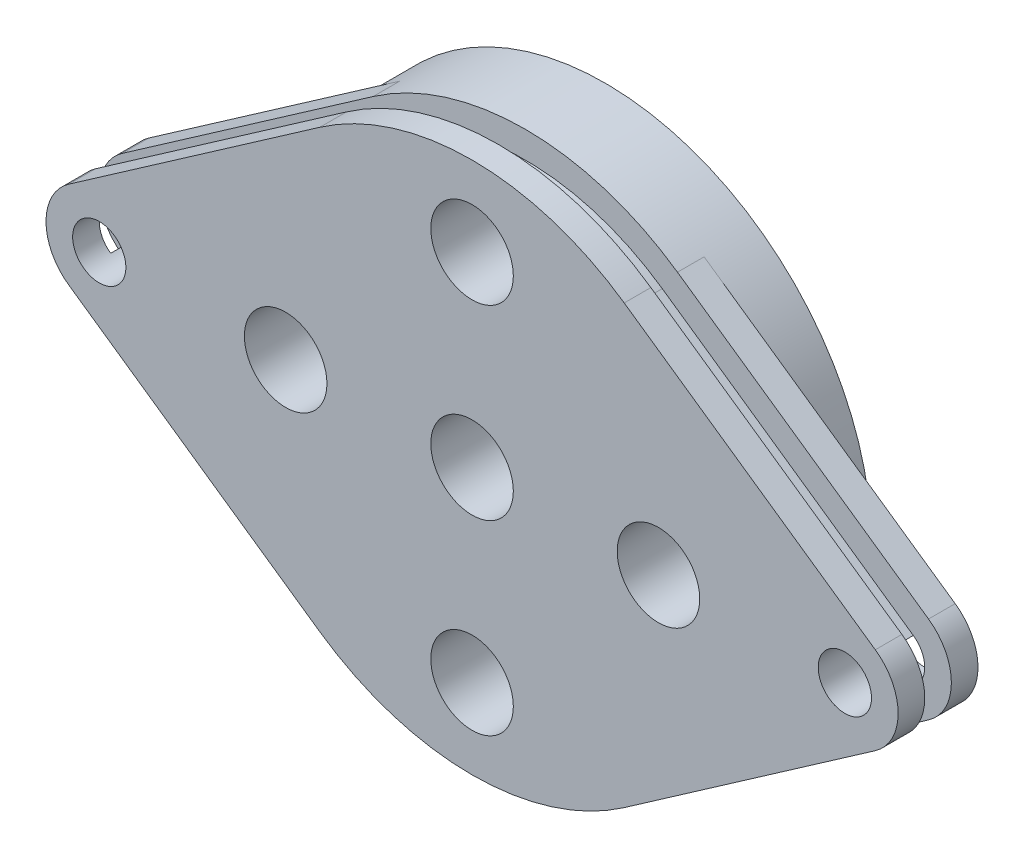
ISO-10303-21;
HEADER;
FILE_DESCRIPTION(('STEP AP214'),'2;1');
FILE_NAME('part.step','',(''),(''),'','','');
FILE_SCHEMA(('AUTOMOTIVE_DESIGN { 1 0 10303 214 1 1 1 1 }'));
ENDSEC;
DATA;
#1=APPLICATION_CONTEXT('core data for automotive mechanical design processes');
#2=APPLICATION_PROTOCOL_DEFINITION('international standard','automotive_design',2000,#1);
#3=PRODUCT_CONTEXT('',#1,'mechanical');
#4=PRODUCT('Part','Part','',(#3));
#5=PRODUCT_RELATED_PRODUCT_CATEGORY('part','',(#4));
#6=PRODUCT_DEFINITION_FORMATION('','',#4);
#7=PRODUCT_DEFINITION_CONTEXT('part definition',#1,'design');
#8=PRODUCT_DEFINITION('design','',#6,#7);
#9=PRODUCT_DEFINITION_SHAPE('','',#8);
#10=(LENGTH_UNIT() NAMED_UNIT(*) SI_UNIT(.MILLI.,.METRE.));
#11=(NAMED_UNIT(*) PLANE_ANGLE_UNIT() SI_UNIT($,.RADIAN.));
#12=(NAMED_UNIT(*) SI_UNIT($,.STERADIAN.) SOLID_ANGLE_UNIT());
#13=UNCERTAINTY_MEASURE_WITH_UNIT(LENGTH_MEASURE(1.E-05),#10,'distance_accuracy_value','');
#14=(GEOMETRIC_REPRESENTATION_CONTEXT(3) GLOBAL_UNCERTAINTY_ASSIGNED_CONTEXT((#13)) GLOBAL_UNIT_ASSIGNED_CONTEXT((#10,
#11,#12)) REPRESENTATION_CONTEXT('',''));
#15=CARTESIAN_POINT('',(0.,0.,0.));
#16=DIRECTION('',(0.,0.,1.));
#17=DIRECTION('',(1.,0.,0.));
#18=AXIS2_PLACEMENT_3D('',#15,#16,#17);
#19=CARTESIAN_POINT('',(0.,0.,0.));
#20=DIRECTION('',(0.,0.,1.));
#21=DIRECTION('',(1.,0.,0.));
#22=AXIS2_PLACEMENT_3D('',#19,#20,#21);
#23=PLANE('',#22);
#24=CARTESIAN_POINT('',(0.,0.,0.));
#25=DIRECTION('',(0.,0.,1.));
#26=DIRECTION('',(1.,0.,0.));
#27=AXIS2_PLACEMENT_3D('',#24,#25,#26);
#28=CIRCLE('',#27,10.);
#29=CARTESIAN_POINT('',(10.,0.,0.));
#30=VERTEX_POINT('',#29);
#31=EDGE_CURVE('E359',#30,#30,#28,.T.);
#32=ORIENTED_EDGE('',*,*,#31,.F.);
#33=EDGE_LOOP('',(#32));
#34=FACE_BOUND('',#33,.T.);
#35=CARTESIAN_POINT('',(0.,0.,0.));
#36=DIRECTION('',(0.,0.,1.));
#37=DIRECTION('',(1.,0.,0.));
#38=AXIS2_PLACEMENT_3D('',#35,#36,#37);
#39=CIRCLE('',#38,1.55);
#40=CARTESIAN_POINT('',(1.55,0.,0.));
#41=VERTEX_POINT('',#40);
#42=EDGE_CURVE('E356',#41,#41,#39,.T.);
#43=ORIENTED_EDGE('',*,*,#42,.T.);
#44=EDGE_LOOP('',(#43));
#45=FACE_BOUND('',#44,.T.);
#46=CARTESIAN_POINT('',(-7.,0.,0.));
#47=DIRECTION('',(0.,0.,1.));
#48=DIRECTION('',(1.,0.,0.));
#49=AXIS2_PLACEMENT_3D('',#46,#47,#48);
#50=CIRCLE('',#49,1.55);
#51=CARTESIAN_POINT('',(-5.45,0.,0.));
#52=VERTEX_POINT('',#51);
#53=EDGE_CURVE('E353',#52,#52,#50,.T.);
#54=ORIENTED_EDGE('',*,*,#53,.T.);
#55=EDGE_LOOP('',(#54));
#56=FACE_BOUND('',#55,.T.);
#57=CARTESIAN_POINT('',(0.,7.,0.));
#58=DIRECTION('',(0.,0.,1.));
#59=DIRECTION('',(1.,0.,0.));
#60=AXIS2_PLACEMENT_3D('',#57,#58,#59);
#61=CIRCLE('',#60,1.55);
#62=CARTESIAN_POINT('',(1.55000000000002,7.,0.));
#63=VERTEX_POINT('',#62);
#64=EDGE_CURVE('E350',#63,#63,#61,.T.);
#65=ORIENTED_EDGE('',*,*,#64,.T.);
#66=EDGE_LOOP('',(#65));
#67=FACE_BOUND('',#66,.T.);
#68=CARTESIAN_POINT('',(7.,0.,0.));
#69=DIRECTION('',(0.,0.,1.));
#70=DIRECTION('',(1.,0.,0.));
#71=AXIS2_PLACEMENT_3D('',#68,#69,#70);
#72=CIRCLE('',#71,1.55);
#73=CARTESIAN_POINT('',(8.55,0.,0.));
#74=VERTEX_POINT('',#73);
#75=EDGE_CURVE('E347',#74,#74,#72,.T.);
#76=ORIENTED_EDGE('',*,*,#75,.T.);
#77=EDGE_LOOP('',(#76));
#78=FACE_BOUND('',#77,.T.);
#79=CARTESIAN_POINT('',(0.,-7.00000000000003,0.));
#80=DIRECTION('',(0.,0.,1.));
#81=DIRECTION('',(1.,0.,0.));
#82=AXIS2_PLACEMENT_3D('',#79,#80,#81);
#83=CIRCLE('',#82,1.55);
#84=CARTESIAN_POINT('',(1.55,-7.00000000000003,0.));
#85=VERTEX_POINT('',#84);
#86=EDGE_CURVE('E344',#85,#85,#83,.T.);
#87=ORIENTED_EDGE('',*,*,#86,.T.);
#88=EDGE_LOOP('',(#87));
#89=FACE_BOUND('',#88,.T.);
#90=ADVANCED_FACE('F45',(#34,#45,#56,#67,#78,#89),#23,.F.);
#91=CARTESIAN_POINT('',(0.,0.,2.));
#92=DIRECTION('',(0.,0.,-1.));
#93=DIRECTION('',(-1.,0.,0.));
#94=AXIS2_PLACEMENT_3D('',#91,#92,#93);
#95=CYLINDRICAL_SURFACE('',#94,10.);
#96=CARTESIAN_POINT('',(0.,0.,2.));
#97=DIRECTION('',(0.,0.,1.));
#98=DIRECTION('',(1.,0.,0.));
#99=AXIS2_PLACEMENT_3D('',#96,#97,#98);
#100=CIRCLE('',#99,10.);
#101=CARTESIAN_POINT('',(-5.71428571428571,8.2065180664829,2.));
#102=VERTEX_POINT('',#101);
#103=CARTESIAN_POINT('',(-5.71428571428571,-8.2065180664829,2.));
#104=VERTEX_POINT('',#103);
#105=EDGE_CURVE('E362',#102,#104,#100,.T.);
#106=ORIENTED_EDGE('',*,*,#105,.F.);
#107=DIRECTION('',(0.,0.,-1.));
#108=VECTOR('',#107,1.);
#109=CARTESIAN_POINT('',(-5.71428571428571,8.2065180664829,3.));
#110=LINE('',#109,#108);
#111=CARTESIAN_POINT('',(-5.71428571428571,8.2065180664829,3.));
#112=VERTEX_POINT('',#111);
#113=EDGE_CURVE('E338',#112,#102,#110,.T.);
#114=ORIENTED_EDGE('',*,*,#113,.F.);
#115=CARTESIAN_POINT('',(0.,0.,3.));
#116=DIRECTION('',(0.,0.,1.));
#117=DIRECTION('',(1.,0.,0.));
#118=AXIS2_PLACEMENT_3D('',#115,#116,#117);
#119=CIRCLE('',#118,10.);
#120=CARTESIAN_POINT('',(5.71428571428571,8.2065180664829,3.));
#121=VERTEX_POINT('',#120);
#122=EDGE_CURVE('E279',#121,#112,#119,.T.);
#123=ORIENTED_EDGE('',*,*,#122,.F.);
#124=DIRECTION('',(0.,0.,-1.));
#125=VECTOR('',#124,1.);
#126=CARTESIAN_POINT('',(5.71428571428571,8.2065180664829,3.));
#127=LINE('',#126,#125);
#128=CARTESIAN_POINT('',(5.71428571428571,8.2065180664829,2.));
#129=VERTEX_POINT('',#128);
#130=EDGE_CURVE('E341',#121,#129,#127,.T.);
#131=ORIENTED_EDGE('',*,*,#130,.T.);
#132=CARTESIAN_POINT('',(5.71428571428571,-8.2065180664829,2.));
#133=VERTEX_POINT('',#132);
#134=EDGE_CURVE('E360',#133,#129,#100,.T.);
#135=ORIENTED_EDGE('',*,*,#134,.F.);
#136=DIRECTION('',(0.,0.,-1.));
#137=VECTOR('',#136,1.);
#138=CARTESIAN_POINT('',(5.71428571428571,-8.2065180664829,3.));
#139=LINE('',#138,#137);
#140=CARTESIAN_POINT('',(5.71428571428571,-8.2065180664829,3.));
#141=VERTEX_POINT('',#140);
#142=EDGE_CURVE('E327',#141,#133,#139,.T.);
#143=ORIENTED_EDGE('',*,*,#142,.F.);
#144=CARTESIAN_POINT('',(0.,0.,3.));
#145=DIRECTION('',(0.,0.,1.));
#146=DIRECTION('',(1.,0.,0.));
#147=AXIS2_PLACEMENT_3D('',#144,#145,#146);
#148=CIRCLE('',#147,10.);
#149=CARTESIAN_POINT('',(-5.71428571428571,-8.2065180664829,3.));
#150=VERTEX_POINT('',#149);
#151=EDGE_CURVE('E290',#150,#141,#148,.T.);
#152=ORIENTED_EDGE('',*,*,#151,.F.);
#153=DIRECTION('',(0.,0.,-1.));
#154=VECTOR('',#153,1.);
#155=CARTESIAN_POINT('',(-5.71428571428571,-8.2065180664829,3.));
#156=LINE('',#155,#154);
#157=EDGE_CURVE('E330',#150,#104,#156,.T.);
#158=ORIENTED_EDGE('',*,*,#157,.T.);
#159=EDGE_LOOP('',(#106,#114,#123,#131,#135,#143,#152,#158));
#160=FACE_BOUND('',#159,.T.);
#161=ORIENTED_EDGE('',*,*,#31,.T.);
#162=EDGE_LOOP('',(#161));
#163=FACE_BOUND('',#162,.T.);
#164=ADVANCED_FACE('F47',(#160,#163),#95,.T.);
#165=CARTESIAN_POINT('',(0.,0.,2.));
#166=DIRECTION('',(0.,0.,-1.));
#167=DIRECTION('',(-1.,0.,0.));
#168=AXIS2_PLACEMENT_3D('',#165,#166,#167);
#169=CYLINDRICAL_SURFACE('',#168,1.55);
#170=ORIENTED_EDGE('',*,*,#42,.F.);
#171=EDGE_LOOP('',(#170));
#172=FACE_BOUND('',#171,.T.);
#173=CARTESIAN_POINT('',(0.,0.,5.));
#174=DIRECTION('',(0.,0.,1.));
#175=DIRECTION('',(1.,0.,0.));
#176=AXIS2_PLACEMENT_3D('',#173,#174,#175);
#177=CIRCLE('',#176,1.55);
#178=CARTESIAN_POINT('',(1.55,0.,5.));
#179=VERTEX_POINT('',#178);
#180=EDGE_CURVE('E935',#179,#179,#177,.T.);
#181=ORIENTED_EDGE('',*,*,#180,.T.);
#182=EDGE_LOOP('',(#181));
#183=FACE_BOUND('',#182,.T.);
#184=ADVANCED_FACE('F477',(#172,#183),#169,.F.);
#185=CARTESIAN_POINT('',(-7.,0.,2.));
#186=DIRECTION('',(0.,0.,-1.));
#187=DIRECTION('',(-1.,0.,0.));
#188=AXIS2_PLACEMENT_3D('',#185,#186,#187);
#189=CYLINDRICAL_SURFACE('',#188,1.55);
#190=ORIENTED_EDGE('',*,*,#53,.F.);
#191=EDGE_LOOP('',(#190));
#192=FACE_BOUND('',#191,.T.);
#193=CARTESIAN_POINT('',(-7.,0.,5.));
#194=DIRECTION('',(0.,0.,1.));
#195=DIRECTION('',(1.,0.,0.));
#196=AXIS2_PLACEMENT_3D('',#193,#194,#195);
#197=CIRCLE('',#196,1.55);
#198=CARTESIAN_POINT('',(-5.45,0.,5.));
#199=VERTEX_POINT('',#198);
#200=EDGE_CURVE('E957',#199,#199,#197,.T.);
#201=ORIENTED_EDGE('',*,*,#200,.T.);
#202=EDGE_LOOP('',(#201));
#203=FACE_BOUND('',#202,.T.);
#204=ADVANCED_FACE('F484',(#192,#203),#189,.F.);
#205=CARTESIAN_POINT('',(0.,7.,2.));
#206=DIRECTION('',(0.,0.,-1.));
#207=DIRECTION('',(-1.,0.,0.));
#208=AXIS2_PLACEMENT_3D('',#205,#206,#207);
#209=CYLINDRICAL_SURFACE('',#208,1.55);
#210=ORIENTED_EDGE('',*,*,#64,.F.);
#211=EDGE_LOOP('',(#210));
#212=FACE_BOUND('',#211,.T.);
#213=CARTESIAN_POINT('',(0.,7.,5.));
#214=DIRECTION('',(0.,0.,1.));
#215=DIRECTION('',(1.,0.,0.));
#216=AXIS2_PLACEMENT_3D('',#213,#214,#215);
#217=CIRCLE('',#216,1.55);
#218=CARTESIAN_POINT('',(1.55000000000002,7.,5.));
#219=VERTEX_POINT('',#218);
#220=EDGE_CURVE('E940',#219,#219,#217,.T.);
#221=ORIENTED_EDGE('',*,*,#220,.T.);
#222=EDGE_LOOP('',(#221));
#223=FACE_BOUND('',#222,.T.);
#224=ADVANCED_FACE('F488',(#212,#223),#209,.F.);
#225=CARTESIAN_POINT('',(7.,0.,2.));
#226=DIRECTION('',(0.,0.,-1.));
#227=DIRECTION('',(-1.,0.,0.));
#228=AXIS2_PLACEMENT_3D('',#225,#226,#227);
#229=CYLINDRICAL_SURFACE('',#228,1.55);
#230=ORIENTED_EDGE('',*,*,#75,.F.);
#231=EDGE_LOOP('',(#230));
#232=FACE_BOUND('',#231,.T.);
#233=CARTESIAN_POINT('',(7.,0.,5.));
#234=DIRECTION('',(0.,0.,1.));
#235=DIRECTION('',(1.,0.,0.));
#236=AXIS2_PLACEMENT_3D('',#233,#234,#235);
#237=CIRCLE('',#236,1.55);
#238=CARTESIAN_POINT('',(8.55,0.,5.));
#239=VERTEX_POINT('',#238);
#240=EDGE_CURVE('E938',#239,#239,#237,.T.);
#241=ORIENTED_EDGE('',*,*,#240,.T.);
#242=EDGE_LOOP('',(#241));
#243=FACE_BOUND('',#242,.T.);
#244=ADVANCED_FACE('F492',(#232,#243),#229,.F.);
#245=CARTESIAN_POINT('',(0.,-7.00000000000003,2.));
#246=DIRECTION('',(0.,0.,-1.));
#247=DIRECTION('',(-1.,0.,0.));
#248=AXIS2_PLACEMENT_3D('',#245,#246,#247);
#249=CYLINDRICAL_SURFACE('',#248,1.55);
#250=ORIENTED_EDGE('',*,*,#86,.F.);
#251=EDGE_LOOP('',(#250));
#252=FACE_BOUND('',#251,.T.);
#253=CARTESIAN_POINT('',(0.,-7.00000000000003,5.));
#254=DIRECTION('',(0.,0.,1.));
#255=DIRECTION('',(1.,0.,0.));
#256=AXIS2_PLACEMENT_3D('',#253,#254,#255);
#257=CIRCLE('',#256,1.55);
#258=CARTESIAN_POINT('',(1.55,-7.00000000000003,5.));
#259=VERTEX_POINT('',#258);
#260=EDGE_CURVE('E941',#259,#259,#257,.T.);
#261=ORIENTED_EDGE('',*,*,#260,.T.);
#262=EDGE_LOOP('',(#261));
#263=FACE_BOUND('',#262,.T.);
#264=ADVANCED_FACE('F496',(#252,#263),#249,.F.);
#265=CARTESIAN_POINT('',(0.,0.,2.));
#266=DIRECTION('',(0.,0.,1.));
#267=DIRECTION('',(1.,0.,0.));
#268=AXIS2_PLACEMENT_3D('',#265,#266,#267);
#269=PLANE('',#268);
#270=ORIENTED_EDGE('',*,*,#105,.T.);
#271=DIRECTION('',(-0.82065180664829,0.571428571428571,0.));
#272=VECTOR('',#271,1.);
#273=CARTESIAN_POINT('',(-5.71428571428571,-8.2065180664829,2.));
#274=LINE('',#273,#272);
#275=CARTESIAN_POINT('',(-15.1428571428571,-1.64130361329658,2.));
#276=VERTEX_POINT('',#275);
#277=EDGE_CURVE('E313',#104,#276,#274,.T.);
#278=ORIENTED_EDGE('',*,*,#277,.T.);
#279=CARTESIAN_POINT('',(-14.,0.,2.));
#280=DIRECTION('',(0.,0.,1.));
#281=DIRECTION('',(1.,0.,0.));
#282=AXIS2_PLACEMENT_3D('',#279,#280,#281);
#283=CIRCLE('',#282,2.);
#284=CARTESIAN_POINT('',(-15.1428571428571,1.64130361329658,2.));
#285=VERTEX_POINT('',#284);
#286=EDGE_CURVE('E310',#285,#276,#283,.T.);
#287=ORIENTED_EDGE('',*,*,#286,.F.);
#288=DIRECTION('',(-0.82065180664829,-0.571428571428571,0.));
#289=VECTOR('',#288,1.);
#290=CARTESIAN_POINT('',(-5.71428571428571,8.2065180664829,2.));
#291=LINE('',#290,#289);
#292=EDGE_CURVE('E307',#102,#285,#291,.T.);
#293=ORIENTED_EDGE('',*,*,#292,.F.);
#294=EDGE_LOOP('',(#270,#278,#287,#293));
#295=FACE_BOUND('',#294,.T.);
#296=CARTESIAN_POINT('',(-14.,0.,2.));
#297=DIRECTION('',(0.,0.,1.));
#298=DIRECTION('',(1.,0.,0.));
#299=AXIS2_PLACEMENT_3D('',#296,#297,#298);
#300=CIRCLE('',#299,1.);
#301=CARTESIAN_POINT('',(-13.,0.,2.));
#302=VERTEX_POINT('',#301);
#303=EDGE_CURVE('E276',#302,#302,#300,.T.);
#304=ORIENTED_EDGE('',*,*,#303,.T.);
#305=EDGE_LOOP('',(#304));
#306=FACE_BOUND('',#305,.T.);
#307=ADVANCED_FACE('F500',(#295,#306),#269,.F.);
#308=ORIENTED_EDGE('',*,*,#134,.T.);
#309=DIRECTION('',(0.82065180664829,-0.571428571428571,0.));
#310=VECTOR('',#309,1.);
#311=CARTESIAN_POINT('',(5.71428571428571,8.2065180664829,2.));
#312=LINE('',#311,#310);
#313=CARTESIAN_POINT('',(15.1428571428571,1.64130361329658,2.));
#314=VERTEX_POINT('',#313);
#315=EDGE_CURVE('E304',#129,#314,#312,.T.);
#316=ORIENTED_EDGE('',*,*,#315,.T.);
#317=CARTESIAN_POINT('',(14.,0.,2.));
#318=DIRECTION('',(0.,0.,1.));
#319=DIRECTION('',(1.,0.,0.));
#320=AXIS2_PLACEMENT_3D('',#317,#318,#319);
#321=CIRCLE('',#320,2.);
#322=CARTESIAN_POINT('',(15.1428571428571,-1.64130361329658,2.));
#323=VERTEX_POINT('',#322);
#324=EDGE_CURVE('E319',#314,#323,#321,.F.);
#325=ORIENTED_EDGE('',*,*,#324,.T.);
#326=DIRECTION('',(0.82065180664829,0.571428571428571,0.));
#327=VECTOR('',#326,1.);
#328=CARTESIAN_POINT('',(5.71428571428571,-8.2065180664829,2.));
#329=LINE('',#328,#327);
#330=EDGE_CURVE('E316',#133,#323,#329,.T.);
#331=ORIENTED_EDGE('',*,*,#330,.F.);
#332=EDGE_LOOP('',(#308,#316,#325,#331));
#333=FACE_BOUND('',#332,.T.);
#334=CARTESIAN_POINT('',(14.,0.,2.));
#335=DIRECTION('',(0.,0.,1.));
#336=DIRECTION('',(1.,0.,0.));
#337=AXIS2_PLACEMENT_3D('',#334,#335,#336);
#338=CIRCLE('',#337,1.);
#339=CARTESIAN_POINT('',(15.,0.,2.));
#340=VERTEX_POINT('',#339);
#341=EDGE_CURVE('E272',#340,#340,#338,.F.);
#342=ORIENTED_EDGE('',*,*,#341,.F.);
#343=EDGE_LOOP('',(#342));
#344=FACE_BOUND('',#343,.T.);
#345=ADVANCED_FACE('F510',(#333,#344),#269,.F.);
#346=CARTESIAN_POINT('',(5.71428571428571,8.2065180664829,3.));
#347=DIRECTION('',(0.571428571428571,0.82065180664829,0.));
#348=DIRECTION('',(-0.82065180664829,0.571428571428571,0.));
#349=AXIS2_PLACEMENT_3D('',#346,#347,#348);
#350=PLANE('',#349);
#351=ORIENTED_EDGE('',*,*,#315,.F.);
#352=ORIENTED_EDGE('',*,*,#130,.F.);
#353=DIRECTION('',(0.82065180664829,-0.571428571428571,0.));
#354=VECTOR('',#353,1.);
#355=CARTESIAN_POINT('',(5.71428571428571,8.2065180664829,3.));
#356=LINE('',#355,#354);
#357=CARTESIAN_POINT('',(15.1428571428571,1.64130361329658,3.));
#358=VERTEX_POINT('',#357);
#359=EDGE_CURVE('E275',#121,#358,#356,.T.);
#360=ORIENTED_EDGE('',*,*,#359,.T.);
#361=DIRECTION('',(0.,0.,-1.));
#362=VECTOR('',#361,1.);
#363=CARTESIAN_POINT('',(15.1428571428571,1.64130361329658,3.));
#364=LINE('',#363,#362);
#365=EDGE_CURVE('E301',#358,#314,#364,.T.);
#366=ORIENTED_EDGE('',*,*,#365,.T.);
#367=EDGE_LOOP('',(#351,#352,#360,#366));
#368=FACE_BOUND('',#367,.T.);
#369=ADVANCED_FACE('F507',(#368),#350,.T.);
#370=CARTESIAN_POINT('',(-5.71428571428571,8.2065180664829,3.));
#371=DIRECTION('',(0.571428571428571,-0.82065180664829,0.));
#372=DIRECTION('',(0.82065180664829,0.571428571428571,0.));
#373=AXIS2_PLACEMENT_3D('',#370,#371,#372);
#374=PLANE('',#373);
#375=ORIENTED_EDGE('',*,*,#292,.T.);
#376=DIRECTION('',(0.,0.,-1.));
#377=VECTOR('',#376,1.);
#378=CARTESIAN_POINT('',(-15.1428571428571,1.64130361329658,3.));
#379=LINE('',#378,#377);
#380=CARTESIAN_POINT('',(-15.1428571428571,1.64130361329658,3.));
#381=VERTEX_POINT('',#380);
#382=EDGE_CURVE('E335',#381,#285,#379,.T.);
#383=ORIENTED_EDGE('',*,*,#382,.F.);
#384=DIRECTION('',(-0.82065180664829,-0.571428571428571,0.));
#385=VECTOR('',#384,1.);
#386=CARTESIAN_POINT('',(-5.71428571428571,8.2065180664829,3.));
#387=LINE('',#386,#385);
#388=EDGE_CURVE('E282',#112,#381,#387,.T.);
#389=ORIENTED_EDGE('',*,*,#388,.F.);
#390=ORIENTED_EDGE('',*,*,#113,.T.);
#391=EDGE_LOOP('',(#375,#383,#389,#390));
#392=FACE_BOUND('',#391,.T.);
#393=ADVANCED_FACE('F509',(#392),#374,.F.);
#394=CARTESIAN_POINT('',(-14.,0.,3.));
#395=DIRECTION('',(0.,0.,-1.));
#396=DIRECTION('',(-1.,0.,0.));
#397=AXIS2_PLACEMENT_3D('',#394,#395,#396);
#398=CYLINDRICAL_SURFACE('',#397,2.);
#399=ORIENTED_EDGE('',*,*,#286,.T.);
#400=DIRECTION('',(0.,0.,-1.));
#401=VECTOR('',#400,1.);
#402=CARTESIAN_POINT('',(-15.1428571428571,-1.64130361329658,3.));
#403=LINE('',#402,#401);
#404=CARTESIAN_POINT('',(-15.1428571428571,-1.64130361329658,3.));
#405=VERTEX_POINT('',#404);
#406=EDGE_CURVE('E333',#405,#276,#403,.T.);
#407=ORIENTED_EDGE('',*,*,#406,.F.);
#408=CARTESIAN_POINT('',(-14.,0.,3.));
#409=DIRECTION('',(0.,0.,1.));
#410=DIRECTION('',(1.,0.,0.));
#411=AXIS2_PLACEMENT_3D('',#408,#409,#410);
#412=CIRCLE('',#411,2.);
#413=EDGE_CURVE('E285',#381,#405,#412,.T.);
#414=ORIENTED_EDGE('',*,*,#413,.F.);
#415=ORIENTED_EDGE('',*,*,#382,.T.);
#416=EDGE_LOOP('',(#399,#407,#414,#415));
#417=FACE_BOUND('',#416,.T.);
#418=ADVANCED_FACE('F514',(#417),#398,.T.);
#419=CARTESIAN_POINT('',(-5.71428571428571,-8.2065180664829,3.));
#420=DIRECTION('',(-0.571428571428571,-0.82065180664829,0.));
#421=DIRECTION('',(0.82065180664829,-0.571428571428571,0.));
#422=AXIS2_PLACEMENT_3D('',#419,#420,#421);
#423=PLANE('',#422);
#424=ORIENTED_EDGE('',*,*,#277,.F.);
#425=ORIENTED_EDGE('',*,*,#157,.F.);
#426=DIRECTION('',(-0.82065180664829,0.571428571428571,0.));
#427=VECTOR('',#426,1.);
#428=CARTESIAN_POINT('',(-5.71428571428571,-8.2065180664829,3.));
#429=LINE('',#428,#427);
#430=EDGE_CURVE('E287',#150,#405,#429,.T.);
#431=ORIENTED_EDGE('',*,*,#430,.T.);
#432=ORIENTED_EDGE('',*,*,#406,.T.);
#433=EDGE_LOOP('',(#424,#425,#431,#432));
#434=FACE_BOUND('',#433,.T.);
#435=ADVANCED_FACE('F518',(#434),#423,.T.);
#436=CARTESIAN_POINT('',(5.71428571428571,-8.2065180664829,3.));
#437=DIRECTION('',(-0.571428571428571,0.82065180664829,0.));
#438=DIRECTION('',(-0.82065180664829,-0.571428571428571,0.));
#439=AXIS2_PLACEMENT_3D('',#436,#437,#438);
#440=PLANE('',#439);
#441=ORIENTED_EDGE('',*,*,#330,.T.);
#442=DIRECTION('',(0.,0.,-1.));
#443=VECTOR('',#442,1.);
#444=CARTESIAN_POINT('',(15.1428571428571,-1.64130361329658,3.));
#445=LINE('',#444,#443);
#446=CARTESIAN_POINT('',(15.1428571428571,-1.64130361329658,3.));
#447=VERTEX_POINT('',#446);
#448=EDGE_CURVE('E325',#447,#323,#445,.T.);
#449=ORIENTED_EDGE('',*,*,#448,.F.);
#450=DIRECTION('',(0.82065180664829,0.571428571428571,0.));
#451=VECTOR('',#450,1.);
#452=CARTESIAN_POINT('',(5.71428571428571,-8.2065180664829,3.));
#453=LINE('',#452,#451);
#454=EDGE_CURVE('E293',#141,#447,#453,.T.);
#455=ORIENTED_EDGE('',*,*,#454,.F.);
#456=ORIENTED_EDGE('',*,*,#142,.T.);
#457=EDGE_LOOP('',(#441,#449,#455,#456));
#458=FACE_BOUND('',#457,.T.);
#459=ADVANCED_FACE('F522',(#458),#440,.F.);
#460=CARTESIAN_POINT('',(-14.,0.,3.));
#461=DIRECTION('',(0.,0.,-1.));
#462=DIRECTION('',(-1.,0.,0.));
#463=AXIS2_PLACEMENT_3D('',#460,#461,#462);
#464=CYLINDRICAL_SURFACE('',#463,1.);
#465=ORIENTED_EDGE('',*,*,#303,.F.);
#466=EDGE_LOOP('',(#465));
#467=FACE_BOUND('',#466,.T.);
#468=DIRECTION('',(0.,0.,-1.));
#469=VECTOR('',#468,1.);
#470=CARTESIAN_POINT('',(-14.5714285714286,0.82065180664829,4.));
#471=LINE('',#470,#469);
#472=CARTESIAN_POINT('',(-14.5714285714286,0.820651806648291,4.));
#473=VERTEX_POINT('',#472);
#474=CARTESIAN_POINT('',(-14.5714285714286,0.820651806648289,3.));
#475=VERTEX_POINT('',#474);
#476=EDGE_CURVE('E266',#473,#475,#471,.T.);
#477=ORIENTED_EDGE('',*,*,#476,.T.);
#478=CARTESIAN_POINT('',(-14.,0.,3.));
#479=DIRECTION('',(0.,0.,1.));
#480=DIRECTION('',(1.,0.,0.));
#481=AXIS2_PLACEMENT_3D('',#478,#479,#480);
#482=CIRCLE('',#481,1.);
#483=CARTESIAN_POINT('',(-14.5714285714286,-0.820651806648292,3.));
#484=VERTEX_POINT('',#483);
#485=EDGE_CURVE('E298',#475,#484,#482,.T.);
#486=ORIENTED_EDGE('',*,*,#485,.T.);
#487=DIRECTION('',(0.,0.,-1.));
#488=VECTOR('',#487,1.);
#489=CARTESIAN_POINT('',(-14.5714285714286,-0.820651806648292,4.));
#490=LINE('',#489,#488);
#491=CARTESIAN_POINT('',(-14.5714285714286,-0.820651806648292,4.));
#492=VERTEX_POINT('',#491);
#493=EDGE_CURVE('E263',#492,#484,#490,.T.);
#494=ORIENTED_EDGE('',*,*,#493,.F.);
#495=CARTESIAN_POINT('',(-14.,0.,4.));
#496=DIRECTION('',(0.,0.,1.));
#497=DIRECTION('',(1.,0.,0.));
#498=AXIS2_PLACEMENT_3D('',#495,#496,#497);
#499=CIRCLE('',#498,1.);
#500=EDGE_CURVE('E388',#473,#492,#499,.T.);
#501=ORIENTED_EDGE('',*,*,#500,.F.);
#502=EDGE_LOOP('',(#477,#486,#494,#501));
#503=FACE_BOUND('',#502,.T.);
#504=CARTESIAN_POINT('',(-14.,0.,5.));
#505=DIRECTION('',(0.,0.,1.));
#506=DIRECTION('',(1.,0.,0.));
#507=AXIS2_PLACEMENT_3D('',#504,#505,#506);
#508=CIRCLE('',#507,1.);
#509=CARTESIAN_POINT('',(-13.,0.,5.));
#510=VERTEX_POINT('',#509);
#511=EDGE_CURVE('E393',#510,#510,#508,.T.);
#512=ORIENTED_EDGE('',*,*,#511,.T.);
#513=EDGE_LOOP('',(#512));
#514=FACE_BOUND('',#513,.T.);
#515=ADVANCED_FACE('F391',(#467,#503,#514),#464,.F.);
#516=CARTESIAN_POINT('',(14.,0.,3.));
#517=DIRECTION('',(0.,0.,-1.));
#518=DIRECTION('',(-1.,0.,0.));
#519=AXIS2_PLACEMENT_3D('',#516,#517,#518);
#520=CYLINDRICAL_SURFACE('',#519,2.);
#521=ORIENTED_EDGE('',*,*,#324,.F.);
#522=ORIENTED_EDGE('',*,*,#365,.F.);
#523=CARTESIAN_POINT('',(14.,0.,3.));
#524=DIRECTION('',(0.,0.,1.));
#525=DIRECTION('',(1.,0.,0.));
#526=AXIS2_PLACEMENT_3D('',#523,#524,#525);
#527=CIRCLE('',#526,2.);
#528=EDGE_CURVE('E295',#358,#447,#527,.F.);
#529=ORIENTED_EDGE('',*,*,#528,.T.);
#530=ORIENTED_EDGE('',*,*,#448,.T.);
#531=EDGE_LOOP('',(#521,#522,#529,#530));
#532=FACE_BOUND('',#531,.T.);
#533=ADVANCED_FACE('F505',(#532),#520,.T.);
#534=CARTESIAN_POINT('',(14.,0.,3.));
#535=DIRECTION('',(0.,0.,-1.));
#536=DIRECTION('',(-1.,0.,0.));
#537=AXIS2_PLACEMENT_3D('',#534,#535,#536);
#538=CYLINDRICAL_SURFACE('',#537,1.);
#539=DIRECTION('',(0.,0.,-1.));
#540=VECTOR('',#539,1.);
#541=CARTESIAN_POINT('',(14.5714285714286,-0.82065180664829,4.));
#542=LINE('',#541,#540);
#543=CARTESIAN_POINT('',(14.5714285714286,-0.820651806648291,4.));
#544=VERTEX_POINT('',#543);
#545=CARTESIAN_POINT('',(14.5714285714286,-0.820651806648289,3.));
#546=VERTEX_POINT('',#545);
#547=EDGE_CURVE('E254',#544,#546,#542,.T.);
#548=ORIENTED_EDGE('',*,*,#547,.T.);
#549=CARTESIAN_POINT('',(14.,0.,3.));
#550=DIRECTION('',(0.,0.,1.));
#551=DIRECTION('',(1.,0.,0.));
#552=AXIS2_PLACEMENT_3D('',#549,#550,#551);
#553=CIRCLE('',#552,1.);
#554=CARTESIAN_POINT('',(14.5714285714286,0.820651806648294,3.));
#555=VERTEX_POINT('',#554);
#556=EDGE_CURVE('E273',#555,#546,#553,.F.);
#557=ORIENTED_EDGE('',*,*,#556,.F.);
#558=DIRECTION('',(0.,0.,-1.));
#559=VECTOR('',#558,1.);
#560=CARTESIAN_POINT('',(14.5714285714286,0.820651806648292,4.));
#561=LINE('',#560,#559);
#562=CARTESIAN_POINT('',(14.5714285714286,0.820651806648292,4.));
#563=VERTEX_POINT('',#562);
#564=EDGE_CURVE('E251',#563,#555,#561,.T.);
#565=ORIENTED_EDGE('',*,*,#564,.F.);
#566=CARTESIAN_POINT('',(14.,0.,4.));
#567=DIRECTION('',(0.,0.,1.));
#568=DIRECTION('',(1.,0.,0.));
#569=AXIS2_PLACEMENT_3D('',#566,#567,#568);
#570=CIRCLE('',#569,1.);
#571=EDGE_CURVE('E399',#544,#563,#570,.T.);
#572=ORIENTED_EDGE('',*,*,#571,.F.);
#573=EDGE_LOOP('',(#548,#557,#565,#572));
#574=FACE_BOUND('',#573,.T.);
#575=ORIENTED_EDGE('',*,*,#341,.T.);
#576=EDGE_LOOP('',(#575));
#577=FACE_BOUND('',#576,.T.);
#578=CARTESIAN_POINT('',(14.,0.,5.));
#579=DIRECTION('',(0.,0.,1.));
#580=DIRECTION('',(1.,0.,0.));
#581=AXIS2_PLACEMENT_3D('',#578,#579,#580);
#582=CIRCLE('',#581,1.);
#583=CARTESIAN_POINT('',(15.,0.,5.));
#584=VERTEX_POINT('',#583);
#585=EDGE_CURVE('E394',#584,#584,#582,.T.);
#586=ORIENTED_EDGE('',*,*,#585,.T.);
#587=EDGE_LOOP('',(#586));
#588=FACE_BOUND('',#587,.T.);
#589=ADVANCED_FACE('F502',(#574,#577,#588),#538,.F.);
#590=CARTESIAN_POINT('',(0.,0.,3.));
#591=DIRECTION('',(0.,0.,1.));
#592=DIRECTION('',(1.,0.,0.));
#593=AXIS2_PLACEMENT_3D('',#590,#591,#592);
#594=PLANE('',#593);
#595=DIRECTION('',(0.82065180664829,-0.571428571428571,0.));
#596=VECTOR('',#595,1.);
#597=CARTESIAN_POINT('',(-5.14285714285713,-7.38586625983461,3.));
#598=LINE('',#597,#596);
#599=CARTESIAN_POINT('',(-5.14285714285712,-7.38586625983461,3.));
#600=VERTEX_POINT('',#599);
#601=EDGE_CURVE('E11',#484,#600,#598,.T.);
#602=ORIENTED_EDGE('',*,*,#601,.F.);
#603=ORIENTED_EDGE('',*,*,#485,.F.);
#604=DIRECTION('',(0.82065180664829,0.571428571428571,0.));
#605=VECTOR('',#604,1.);
#606=CARTESIAN_POINT('',(-5.14285714285713,7.38586625983461,3.));
#607=LINE('',#606,#605);
#608=CARTESIAN_POINT('',(-5.14285714285716,7.38586625983459,3.));
#609=VERTEX_POINT('',#608);
#610=EDGE_CURVE('E371',#475,#609,#607,.T.);
#611=ORIENTED_EDGE('',*,*,#610,.T.);
#612=CARTESIAN_POINT('',(0.,-3.88578058618805E-13,3.));
#613=DIRECTION('',(0.,0.,1.));
#614=DIRECTION('',(1.,0.,0.));
#615=AXIS2_PLACEMENT_3D('',#612,#613,#614);
#616=CIRCLE('',#615,9.00000000000031);
#617=CARTESIAN_POINT('',(5.14285714285714,7.38586625983461,3.));
#618=VERTEX_POINT('',#617);
#619=EDGE_CURVE('E368',#618,#609,#616,.T.);
#620=ORIENTED_EDGE('',*,*,#619,.F.);
#621=DIRECTION('',(-0.82065180664829,0.571428571428571,0.));
#622=VECTOR('',#621,1.);
#623=CARTESIAN_POINT('',(5.14285714285714,7.38586625983461,3.));
#624=LINE('',#623,#622);
#625=EDGE_CURVE('E365',#555,#618,#624,.T.);
#626=ORIENTED_EDGE('',*,*,#625,.F.);
#627=ORIENTED_EDGE('',*,*,#556,.T.);
#628=DIRECTION('',(-0.82065180664829,-0.571428571428571,0.));
#629=VECTOR('',#628,1.);
#630=CARTESIAN_POINT('',(5.14285714285714,-7.38586625983461,3.));
#631=LINE('',#630,#629);
#632=CARTESIAN_POINT('',(5.14285714285712,-7.38586625983462,3.));
#633=VERTEX_POINT('',#632);
#634=EDGE_CURVE('E63',#546,#633,#631,.T.);
#635=ORIENTED_EDGE('',*,*,#634,.T.);
#636=CARTESIAN_POINT('',(0.,-3.88578058618805E-13,3.));
#637=DIRECTION('',(0.,0.,1.));
#638=DIRECTION('',(1.,0.,0.));
#639=AXIS2_PLACEMENT_3D('',#636,#637,#638);
#640=CIRCLE('',#639,8.99999999999967);
#641=EDGE_CURVE('E53',#633,#600,#640,.F.);
#642=ORIENTED_EDGE('',*,*,#641,.T.);
#643=EDGE_LOOP('',(#602,#603,#611,#620,#626,#627,#635,#642));
#644=FACE_BOUND('',#643,.T.);
#645=ORIENTED_EDGE('',*,*,#359,.F.);
#646=ORIENTED_EDGE('',*,*,#122,.T.);
#647=ORIENTED_EDGE('',*,*,#388,.T.);
#648=ORIENTED_EDGE('',*,*,#413,.T.);
#649=ORIENTED_EDGE('',*,*,#430,.F.);
#650=ORIENTED_EDGE('',*,*,#151,.T.);
#651=ORIENTED_EDGE('',*,*,#454,.T.);
#652=ORIENTED_EDGE('',*,*,#528,.F.);
#653=EDGE_LOOP('',(#645,#646,#647,#648,#649,#650,#651,#652));
#654=FACE_BOUND('',#653,.T.);
#655=ADVANCED_FACE('F374',(#644,#654),#594,.T.);
#656=CARTESIAN_POINT('',(0.,-3.88578058618805E-13,4.));
#657=DIRECTION('',(0.,0.,-1.));
#658=DIRECTION('',(-1.,0.,0.));
#659=AXIS2_PLACEMENT_3D('',#656,#657,#658);
#660=CYLINDRICAL_SURFACE('',#659,9.00000000000031);
#661=DIRECTION('',(0.,0.,-1.));
#662=VECTOR('',#661,1.);
#663=CARTESIAN_POINT('',(5.14285714285714,7.38586625983461,4.));
#664=LINE('',#663,#662);
#665=CARTESIAN_POINT('',(5.14285714285714,7.38586625983461,4.));
#666=VERTEX_POINT('',#665);
#667=EDGE_CURVE('E248',#666,#618,#664,.T.);
#668=ORIENTED_EDGE('',*,*,#667,.T.);
#669=ORIENTED_EDGE('',*,*,#619,.T.);
#670=DIRECTION('',(0.,0.,-1.));
#671=VECTOR('',#670,1.);
#672=CARTESIAN_POINT('',(-5.14285714285716,7.38586625983459,4.));
#673=LINE('',#672,#671);
#674=CARTESIAN_POINT('',(-5.14285714285716,7.38586625983459,4.));
#675=VERTEX_POINT('',#674);
#676=EDGE_CURVE('E269',#675,#609,#673,.T.);
#677=ORIENTED_EDGE('',*,*,#676,.F.);
#678=CARTESIAN_POINT('',(0.,-3.88578058618805E-13,4.));
#679=DIRECTION('',(0.,0.,1.));
#680=DIRECTION('',(1.,0.,0.));
#681=AXIS2_PLACEMENT_3D('',#678,#679,#680);
#682=CIRCLE('',#681,9.00000000000031);
#683=EDGE_CURVE('E228',#675,#666,#682,.F.);
#684=ORIENTED_EDGE('',*,*,#683,.T.);
#685=EDGE_LOOP('',(#668,#669,#677,#684));
#686=FACE_BOUND('',#685,.T.);
#687=ADVANCED_FACE('F380',(#686),#660,.T.);
#688=CARTESIAN_POINT('',(-5.14285714285713,7.38586625983461,4.));
#689=DIRECTION('',(0.571428571428571,-0.82065180664829,0.));
#690=DIRECTION('',(0.82065180664829,0.571428571428571,0.));
#691=AXIS2_PLACEMENT_3D('',#688,#689,#690);
#692=PLANE('',#691);
#693=ORIENTED_EDGE('',*,*,#610,.F.);
#694=ORIENTED_EDGE('',*,*,#476,.F.);
#695=DIRECTION('',(-0.82065180664829,-0.571428571428571,0.));
#696=VECTOR('',#695,1.);
#697=CARTESIAN_POINT('',(-5.14285714285713,7.38586625983461,4.));
#698=LINE('',#697,#696);
#699=EDGE_CURVE('E231',#675,#473,#698,.T.);
#700=ORIENTED_EDGE('',*,*,#699,.F.);
#701=ORIENTED_EDGE('',*,*,#676,.T.);
#702=EDGE_LOOP('',(#693,#694,#700,#701));
#703=FACE_BOUND('',#702,.T.);
#704=ADVANCED_FACE('F383',(#703),#692,.F.);
#705=CARTESIAN_POINT('',(-5.14285714285713,-7.38586625983461,4.));
#706=DIRECTION('',(-0.571428571428571,-0.82065180664829,0.));
#707=DIRECTION('',(0.82065180664829,-0.571428571428571,0.));
#708=AXIS2_PLACEMENT_3D('',#705,#706,#707);
#709=PLANE('',#708);
#710=ORIENTED_EDGE('',*,*,#493,.T.);
#711=ORIENTED_EDGE('',*,*,#601,.T.);
#712=DIRECTION('',(0.,0.,-1.));
#713=VECTOR('',#712,1.);
#714=CARTESIAN_POINT('',(-5.14285714285712,-7.38586625983461,4.));
#715=LINE('',#714,#713);
#716=CARTESIAN_POINT('',(-5.14285714285712,-7.38586625983461,4.));
#717=VERTEX_POINT('',#716);
#718=EDGE_CURVE('E260',#717,#600,#715,.T.);
#719=ORIENTED_EDGE('',*,*,#718,.F.);
#720=DIRECTION('',(-0.82065180664829,0.571428571428571,0.));
#721=VECTOR('',#720,1.);
#722=CARTESIAN_POINT('',(-5.14285714285713,-7.38586625983461,4.));
#723=LINE('',#722,#721);
#724=EDGE_CURVE('E238',#717,#492,#723,.T.);
#725=ORIENTED_EDGE('',*,*,#724,.T.);
#726=EDGE_LOOP('',(#710,#711,#719,#725));
#727=FACE_BOUND('',#726,.T.);
#728=ADVANCED_FACE('F542',(#727),#709,.T.);
#729=CARTESIAN_POINT('',(0.,-3.88578058618805E-13,4.));
#730=DIRECTION('',(0.,0.,-1.));
#731=DIRECTION('',(-1.,0.,0.));
#732=AXIS2_PLACEMENT_3D('',#729,#730,#731);
#733=CYLINDRICAL_SURFACE('',#732,8.99999999999967);
#734=ORIENTED_EDGE('',*,*,#641,.F.);
#735=DIRECTION('',(0.,0.,-1.));
#736=VECTOR('',#735,1.);
#737=CARTESIAN_POINT('',(5.14285714285712,-7.38586625983462,4.));
#738=LINE('',#737,#736);
#739=CARTESIAN_POINT('',(5.14285714285712,-7.38586625983462,4.));
#740=VERTEX_POINT('',#739);
#741=EDGE_CURVE('E257',#740,#633,#738,.T.);
#742=ORIENTED_EDGE('',*,*,#741,.F.);
#743=CARTESIAN_POINT('',(0.,-3.88578058618805E-13,4.));
#744=DIRECTION('',(0.,0.,1.));
#745=DIRECTION('',(1.,0.,0.));
#746=AXIS2_PLACEMENT_3D('',#743,#744,#745);
#747=CIRCLE('',#746,8.99999999999967);
#748=EDGE_CURVE('E241',#717,#740,#747,.T.);
#749=ORIENTED_EDGE('',*,*,#748,.F.);
#750=ORIENTED_EDGE('',*,*,#718,.T.);
#751=EDGE_LOOP('',(#734,#742,#749,#750));
#752=FACE_BOUND('',#751,.T.);
#753=ADVANCED_FACE('F545',(#752),#733,.T.);
#754=CARTESIAN_POINT('',(5.14285714285714,-7.38586625983461,4.));
#755=DIRECTION('',(-0.571428571428571,0.82065180664829,0.));
#756=DIRECTION('',(-0.82065180664829,-0.571428571428571,0.));
#757=AXIS2_PLACEMENT_3D('',#754,#755,#756);
#758=PLANE('',#757);
#759=ORIENTED_EDGE('',*,*,#634,.F.);
#760=ORIENTED_EDGE('',*,*,#547,.F.);
#761=DIRECTION('',(0.82065180664829,0.571428571428571,0.));
#762=VECTOR('',#761,1.);
#763=CARTESIAN_POINT('',(5.14285714285714,-7.38586625983461,4.));
#764=LINE('',#763,#762);
#765=EDGE_CURVE('E243',#740,#544,#764,.T.);
#766=ORIENTED_EDGE('',*,*,#765,.F.);
#767=ORIENTED_EDGE('',*,*,#741,.T.);
#768=EDGE_LOOP('',(#759,#760,#766,#767));
#769=FACE_BOUND('',#768,.T.);
#770=ADVANCED_FACE('F549',(#769),#758,.F.);
#771=CARTESIAN_POINT('',(5.14285714285714,7.38586625983461,4.));
#772=DIRECTION('',(0.571428571428571,0.82065180664829,0.));
#773=DIRECTION('',(-0.82065180664829,0.571428571428571,0.));
#774=AXIS2_PLACEMENT_3D('',#771,#772,#773);
#775=PLANE('',#774);
#776=ORIENTED_EDGE('',*,*,#564,.T.);
#777=ORIENTED_EDGE('',*,*,#625,.T.);
#778=ORIENTED_EDGE('',*,*,#667,.F.);
#779=DIRECTION('',(0.82065180664829,-0.571428571428571,0.));
#780=VECTOR('',#779,1.);
#781=CARTESIAN_POINT('',(5.14285714285714,7.38586625983461,4.));
#782=LINE('',#781,#780);
#783=EDGE_CURVE('E245',#666,#563,#782,.T.);
#784=ORIENTED_EDGE('',*,*,#783,.T.);
#785=EDGE_LOOP('',(#776,#777,#778,#784));
#786=FACE_BOUND('',#785,.T.);
#787=ADVANCED_FACE('F553',(#786),#775,.T.);
#788=CARTESIAN_POINT('',(14.,0.,5.));
#789=DIRECTION('',(0.,0.,1.));
#790=DIRECTION('',(1.,0.,0.));
#791=AXIS2_PLACEMENT_3D('',#788,#789,#790);
#792=PLANE('',#791);
#793=ORIENTED_EDGE('',*,*,#180,.F.);
#794=EDGE_LOOP('',(#793));
#795=FACE_BOUND('',#794,.T.);
#796=ORIENTED_EDGE('',*,*,#240,.F.);
#797=EDGE_LOOP('',(#796));
#798=FACE_BOUND('',#797,.T.);
#799=ORIENTED_EDGE('',*,*,#585,.F.);
#800=EDGE_LOOP('',(#799));
#801=FACE_BOUND('',#800,.T.);
#802=CARTESIAN_POINT('',(14.,0.,5.));
#803=DIRECTION('',(0.,0.,1.));
#804=DIRECTION('',(1.,0.,0.));
#805=AXIS2_PLACEMENT_3D('',#802,#803,#804);
#806=CIRCLE('',#805,2.);
#807=CARTESIAN_POINT('',(15.1428571428571,-1.64130361329658,5.));
#808=VERTEX_POINT('',#807);
#809=CARTESIAN_POINT('',(15.1428571428571,1.64130361329658,5.));
#810=VERTEX_POINT('',#809);
#811=EDGE_CURVE('E213',#808,#810,#806,.T.);
#812=ORIENTED_EDGE('',*,*,#811,.T.);
#813=DIRECTION('',(-0.82065180664829,0.571428571428571,0.));
#814=VECTOR('',#813,1.);
#815=CARTESIAN_POINT('',(15.1428571428571,1.64130361329658,5.));
#816=LINE('',#815,#814);
#817=CARTESIAN_POINT('',(5.71428571428571,8.2065180664829,5.));
#818=VERTEX_POINT('',#817);
#819=EDGE_CURVE('E202',#810,#818,#816,.T.);
#820=ORIENTED_EDGE('',*,*,#819,.T.);
#821=CARTESIAN_POINT('',(0.,0.,5.));
#822=DIRECTION('',(0.,0.,1.));
#823=DIRECTION('',(1.,0.,0.));
#824=AXIS2_PLACEMENT_3D('',#821,#822,#823);
#825=CIRCLE('',#824,10.);
#826=CARTESIAN_POINT('',(-5.71428571428571,8.2065180664829,5.));
#827=VERTEX_POINT('',#826);
#828=EDGE_CURVE('E212',#818,#827,#825,.T.);
#829=ORIENTED_EDGE('',*,*,#828,.T.);
#830=DIRECTION('',(-0.82065180664829,-0.571428571428571,0.));
#831=VECTOR('',#830,1.);
#832=CARTESIAN_POINT('',(-5.71428571428571,8.2065180664829,5.));
#833=LINE('',#832,#831);
#834=CARTESIAN_POINT('',(-15.1428571428571,1.64130361329658,5.));
#835=VERTEX_POINT('',#834);
#836=EDGE_CURVE('E404',#827,#835,#833,.T.);
#837=ORIENTED_EDGE('',*,*,#836,.T.);
#838=CARTESIAN_POINT('',(-14.,0.,5.));
#839=DIRECTION('',(0.,0.,1.));
#840=DIRECTION('',(1.,0.,0.));
#841=AXIS2_PLACEMENT_3D('',#838,#839,#840);
#842=CIRCLE('',#841,2.);
#843=CARTESIAN_POINT('',(-15.1428571428571,-1.64130361329658,5.));
#844=VERTEX_POINT('',#843);
#845=EDGE_CURVE('E406',#835,#844,#842,.T.);
#846=ORIENTED_EDGE('',*,*,#845,.T.);
#847=DIRECTION('',(0.82065180664829,-0.571428571428571,0.));
#848=VECTOR('',#847,1.);
#849=CARTESIAN_POINT('',(-15.1428571428571,-1.64130361329658,5.));
#850=LINE('',#849,#848);
#851=CARTESIAN_POINT('',(-5.71428571428571,-8.2065180664829,5.));
#852=VERTEX_POINT('',#851);
#853=EDGE_CURVE('E408',#844,#852,#850,.T.);
#854=ORIENTED_EDGE('',*,*,#853,.T.);
#855=CARTESIAN_POINT('',(0.,0.,5.));
#856=DIRECTION('',(0.,0.,1.));
#857=DIRECTION('',(1.,0.,0.));
#858=AXIS2_PLACEMENT_3D('',#855,#856,#857);
#859=CIRCLE('',#858,10.);
#860=CARTESIAN_POINT('',(5.7142857142857,-8.2065180664829,5.));
#861=VERTEX_POINT('',#860);
#862=EDGE_CURVE('E410',#852,#861,#859,.T.);
#863=ORIENTED_EDGE('',*,*,#862,.T.);
#864=DIRECTION('',(0.82065180664829,0.571428571428571,0.));
#865=VECTOR('',#864,1.);
#866=CARTESIAN_POINT('',(5.7142857142857,-8.2065180664829,5.));
#867=LINE('',#866,#865);
#868=EDGE_CURVE('E219',#861,#808,#867,.T.);
#869=ORIENTED_EDGE('',*,*,#868,.T.);
#870=EDGE_LOOP('',(#812,#820,#829,#837,#846,#854,#863,#869));
#871=FACE_BOUND('',#870,.T.);
#872=ORIENTED_EDGE('',*,*,#511,.F.);
#873=EDGE_LOOP('',(#872));
#874=FACE_BOUND('',#873,.T.);
#875=ORIENTED_EDGE('',*,*,#220,.F.);
#876=EDGE_LOOP('',(#875));
#877=FACE_BOUND('',#876,.T.);
#878=ORIENTED_EDGE('',*,*,#260,.F.);
#879=EDGE_LOOP('',(#878));
#880=FACE_BOUND('',#879,.T.);
#881=ORIENTED_EDGE('',*,*,#200,.F.);
#882=EDGE_LOOP('',(#881));
#883=FACE_BOUND('',#882,.T.);
#884=ADVANCED_FACE('F216',(#795,#798,#801,#871,#874,#877,#880,#883),#792,.T.);
#885=CARTESIAN_POINT('',(14.,0.,4.));
#886=DIRECTION('',(0.,0.,1.));
#887=DIRECTION('',(1.,0.,0.));
#888=AXIS2_PLACEMENT_3D('',#885,#886,#887);
#889=PLANE('',#888);
#890=ORIENTED_EDGE('',*,*,#724,.F.);
#891=ORIENTED_EDGE('',*,*,#748,.T.);
#892=ORIENTED_EDGE('',*,*,#765,.T.);
#893=ORIENTED_EDGE('',*,*,#571,.T.);
#894=ORIENTED_EDGE('',*,*,#783,.F.);
#895=ORIENTED_EDGE('',*,*,#683,.F.);
#896=ORIENTED_EDGE('',*,*,#699,.T.);
#897=ORIENTED_EDGE('',*,*,#500,.T.);
#898=EDGE_LOOP('',(#890,#891,#892,#893,#894,#895,#896,#897));
#899=FACE_BOUND('',#898,.T.);
#900=CARTESIAN_POINT('',(14.,0.,4.));
#901=DIRECTION('',(0.,0.,1.));
#902=DIRECTION('',(1.,0.,0.));
#903=AXIS2_PLACEMENT_3D('',#900,#901,#902);
#904=CIRCLE('',#903,2.);
#905=CARTESIAN_POINT('',(15.1428571428571,-1.64130361329658,4.));
#906=VERTEX_POINT('',#905);
#907=CARTESIAN_POINT('',(15.1428571428571,1.64130361329658,4.));
#908=VERTEX_POINT('',#907);
#909=EDGE_CURVE('E227',#906,#908,#904,.T.);
#910=ORIENTED_EDGE('',*,*,#909,.F.);
#911=DIRECTION('',(0.82065180664829,0.571428571428571,0.));
#912=VECTOR('',#911,1.);
#913=CARTESIAN_POINT('',(5.7142857142857,-8.2065180664829,4.));
#914=LINE('',#913,#912);
#915=CARTESIAN_POINT('',(5.7142857142857,-8.2065180664829,4.));
#916=VERTEX_POINT('',#915);
#917=EDGE_CURVE('E223',#916,#906,#914,.T.);
#918=ORIENTED_EDGE('',*,*,#917,.F.);
#919=CARTESIAN_POINT('',(0.,0.,4.));
#920=DIRECTION('',(0.,0.,1.));
#921=DIRECTION('',(1.,0.,0.));
#922=AXIS2_PLACEMENT_3D('',#919,#920,#921);
#923=CIRCLE('',#922,10.);
#924=CARTESIAN_POINT('',(-5.71428571428571,-8.2065180664829,4.));
#925=VERTEX_POINT('',#924);
#926=EDGE_CURVE('E425',#925,#916,#923,.T.);
#927=ORIENTED_EDGE('',*,*,#926,.F.);
#928=DIRECTION('',(0.82065180664829,-0.571428571428571,0.));
#929=VECTOR('',#928,1.);
#930=CARTESIAN_POINT('',(-15.1428571428571,-1.64130361329658,4.));
#931=LINE('',#930,#929);
#932=CARTESIAN_POINT('',(-15.1428571428571,-1.64130361329658,4.));
#933=VERTEX_POINT('',#932);
#934=EDGE_CURVE('E423',#933,#925,#931,.T.);
#935=ORIENTED_EDGE('',*,*,#934,.F.);
#936=CARTESIAN_POINT('',(-14.,0.,4.));
#937=DIRECTION('',(0.,0.,1.));
#938=DIRECTION('',(1.,0.,0.));
#939=AXIS2_PLACEMENT_3D('',#936,#937,#938);
#940=CIRCLE('',#939,2.);
#941=CARTESIAN_POINT('',(-15.1428571428571,1.64130361329658,4.));
#942=VERTEX_POINT('',#941);
#943=EDGE_CURVE('E421',#942,#933,#940,.T.);
#944=ORIENTED_EDGE('',*,*,#943,.F.);
#945=DIRECTION('',(-0.82065180664829,-0.571428571428571,0.));
#946=VECTOR('',#945,1.);
#947=CARTESIAN_POINT('',(-5.71428571428571,8.2065180664829,4.));
#948=LINE('',#947,#946);
#949=CARTESIAN_POINT('',(-5.71428571428571,8.2065180664829,4.));
#950=VERTEX_POINT('',#949);
#951=EDGE_CURVE('E419',#950,#942,#948,.T.);
#952=ORIENTED_EDGE('',*,*,#951,.F.);
#953=CARTESIAN_POINT('',(0.,0.,4.));
#954=DIRECTION('',(0.,0.,1.));
#955=DIRECTION('',(1.,0.,0.));
#956=AXIS2_PLACEMENT_3D('',#953,#954,#955);
#957=CIRCLE('',#956,10.);
#958=CARTESIAN_POINT('',(5.71428571428571,8.2065180664829,4.));
#959=VERTEX_POINT('',#958);
#960=EDGE_CURVE('E417',#959,#950,#957,.T.);
#961=ORIENTED_EDGE('',*,*,#960,.F.);
#962=DIRECTION('',(-0.82065180664829,0.571428571428571,0.));
#963=VECTOR('',#962,1.);
#964=CARTESIAN_POINT('',(15.1428571428571,1.64130361329658,4.));
#965=LINE('',#964,#963);
#966=EDGE_CURVE('E415',#908,#959,#965,.T.);
#967=ORIENTED_EDGE('',*,*,#966,.F.);
#968=EDGE_LOOP('',(#910,#918,#927,#935,#944,#952,#961,#967));
#969=FACE_BOUND('',#968,.T.);
#970=ADVANCED_FACE('F386',(#899,#969),#889,.F.);
#971=CARTESIAN_POINT('',(14.,0.,5.));
#972=DIRECTION('',(0.,0.,-1.));
#973=DIRECTION('',(-1.,0.,0.));
#974=AXIS2_PLACEMENT_3D('',#971,#972,#973);
#975=CYLINDRICAL_SURFACE('',#974,2.);
#976=ORIENTED_EDGE('',*,*,#909,.T.);
#977=DIRECTION('',(0.,0.,-1.));
#978=VECTOR('',#977,1.);
#979=CARTESIAN_POINT('',(15.1428571428571,1.64130361329658,5.));
#980=LINE('',#979,#978);
#981=EDGE_CURVE('E206',#810,#908,#980,.T.);
#982=ORIENTED_EDGE('',*,*,#981,.F.);
#983=ORIENTED_EDGE('',*,*,#811,.F.);
#984=DIRECTION('',(0.,0.,-1.));
#985=VECTOR('',#984,1.);
#986=CARTESIAN_POINT('',(15.1428571428571,-1.64130361329658,5.));
#987=LINE('',#986,#985);
#988=EDGE_CURVE('E413',#808,#906,#987,.T.);
#989=ORIENTED_EDGE('',*,*,#988,.T.);
#990=EDGE_LOOP('',(#976,#982,#983,#989));
#991=FACE_BOUND('',#990,.T.);
#992=ADVANCED_FACE('F225',(#991),#975,.T.);
#993=CARTESIAN_POINT('',(15.1428571428571,1.64130361329658,5.));
#994=DIRECTION('',(-0.571428571428571,-0.82065180664829,0.));
#995=DIRECTION('',(0.82065180664829,-0.571428571428571,0.));
#996=AXIS2_PLACEMENT_3D('',#993,#994,#995);
#997=PLANE('',#996);
#998=ORIENTED_EDGE('',*,*,#966,.T.);
#999=DIRECTION('',(0.,0.,-1.));
#1000=VECTOR('',#999,1.);
#1001=CARTESIAN_POINT('',(5.71428571428571,8.2065180664829,5.));
#1002=LINE('',#1001,#1000);
#1003=EDGE_CURVE('E209',#818,#959,#1002,.T.);
#1004=ORIENTED_EDGE('',*,*,#1003,.F.);
#1005=ORIENTED_EDGE('',*,*,#819,.F.);
#1006=ORIENTED_EDGE('',*,*,#981,.T.);
#1007=EDGE_LOOP('',(#998,#1004,#1005,#1006));
#1008=FACE_BOUND('',#1007,.T.);
#1009=ADVANCED_FACE('F204',(#1008),#997,.F.);
#1010=CARTESIAN_POINT('',(0.,0.,5.));
#1011=DIRECTION('',(0.,0.,-1.));
#1012=DIRECTION('',(-1.,0.,0.));
#1013=AXIS2_PLACEMENT_3D('',#1010,#1011,#1012);
#1014=CYLINDRICAL_SURFACE('',#1013,10.);
#1015=ORIENTED_EDGE('',*,*,#960,.T.);
#1016=DIRECTION('',(0.,0.,-1.));
#1017=VECTOR('',#1016,1.);
#1018=CARTESIAN_POINT('',(-5.71428571428571,8.2065180664829,5.));
#1019=LINE('',#1018,#1017);
#1020=EDGE_CURVE('E233',#827,#950,#1019,.T.);
#1021=ORIENTED_EDGE('',*,*,#1020,.F.);
#1022=ORIENTED_EDGE('',*,*,#828,.F.);
#1023=ORIENTED_EDGE('',*,*,#1003,.T.);
#1024=EDGE_LOOP('',(#1015,#1021,#1022,#1023));
#1025=FACE_BOUND('',#1024,.T.);
#1026=ADVANCED_FACE('F462',(#1025),#1014,.T.);
#1027=CARTESIAN_POINT('',(-5.71428571428571,8.2065180664829,5.));
#1028=DIRECTION('',(0.571428571428571,-0.82065180664829,0.));
#1029=DIRECTION('',(0.82065180664829,0.571428571428571,0.));
#1030=AXIS2_PLACEMENT_3D('',#1027,#1028,#1029);
#1031=PLANE('',#1030);
#1032=ORIENTED_EDGE('',*,*,#951,.T.);
#1033=DIRECTION('',(0.,0.,-1.));
#1034=VECTOR('',#1033,1.);
#1035=CARTESIAN_POINT('',(-15.1428571428571,1.64130361329658,5.));
#1036=LINE('',#1035,#1034);
#1037=EDGE_CURVE('E438',#835,#942,#1036,.T.);
#1038=ORIENTED_EDGE('',*,*,#1037,.F.);
#1039=ORIENTED_EDGE('',*,*,#836,.F.);
#1040=ORIENTED_EDGE('',*,*,#1020,.T.);
#1041=EDGE_LOOP('',(#1032,#1038,#1039,#1040));
#1042=FACE_BOUND('',#1041,.T.);
#1043=ADVANCED_FACE('F445',(#1042),#1031,.F.);
#1044=CARTESIAN_POINT('',(-14.,0.,5.));
#1045=DIRECTION('',(0.,0.,-1.));
#1046=DIRECTION('',(-1.,0.,0.));
#1047=AXIS2_PLACEMENT_3D('',#1044,#1045,#1046);
#1048=CYLINDRICAL_SURFACE('',#1047,2.);
#1049=ORIENTED_EDGE('',*,*,#943,.T.);
#1050=DIRECTION('',(0.,0.,-1.));
#1051=VECTOR('',#1050,1.);
#1052=CARTESIAN_POINT('',(-15.1428571428571,-1.64130361329658,5.));
#1053=LINE('',#1052,#1051);
#1054=EDGE_CURVE('E435',#844,#933,#1053,.T.);
#1055=ORIENTED_EDGE('',*,*,#1054,.F.);
#1056=ORIENTED_EDGE('',*,*,#845,.F.);
#1057=ORIENTED_EDGE('',*,*,#1037,.T.);
#1058=EDGE_LOOP('',(#1049,#1055,#1056,#1057));
#1059=FACE_BOUND('',#1058,.T.);
#1060=ADVANCED_FACE('F454',(#1059),#1048,.T.);
#1061=CARTESIAN_POINT('',(-15.1428571428571,-1.64130361329658,5.));
#1062=DIRECTION('',(0.571428571428571,0.82065180664829,0.));
#1063=DIRECTION('',(-0.82065180664829,0.571428571428571,0.));
#1064=AXIS2_PLACEMENT_3D('',#1061,#1062,#1063);
#1065=PLANE('',#1064);
#1066=ORIENTED_EDGE('',*,*,#934,.T.);
#1067=DIRECTION('',(0.,0.,-1.));
#1068=VECTOR('',#1067,1.);
#1069=CARTESIAN_POINT('',(-5.71428571428571,-8.2065180664829,5.));
#1070=LINE('',#1069,#1068);
#1071=EDGE_CURVE('E432',#852,#925,#1070,.T.);
#1072=ORIENTED_EDGE('',*,*,#1071,.F.);
#1073=ORIENTED_EDGE('',*,*,#853,.F.);
#1074=ORIENTED_EDGE('',*,*,#1054,.T.);
#1075=EDGE_LOOP('',(#1066,#1072,#1073,#1074));
#1076=FACE_BOUND('',#1075,.T.);
#1077=ADVANCED_FACE('F458',(#1076),#1065,.F.);
#1078=CARTESIAN_POINT('',(0.,0.,5.));
#1079=DIRECTION('',(0.,0.,-1.));
#1080=DIRECTION('',(-1.,0.,0.));
#1081=AXIS2_PLACEMENT_3D('',#1078,#1079,#1080);
#1082=CYLINDRICAL_SURFACE('',#1081,10.);
#1083=ORIENTED_EDGE('',*,*,#926,.T.);
#1084=DIRECTION('',(0.,0.,-1.));
#1085=VECTOR('',#1084,1.);
#1086=CARTESIAN_POINT('',(5.7142857142857,-8.2065180664829,5.));
#1087=LINE('',#1086,#1085);
#1088=EDGE_CURVE('E429',#861,#916,#1087,.T.);
#1089=ORIENTED_EDGE('',*,*,#1088,.F.);
#1090=ORIENTED_EDGE('',*,*,#862,.F.);
#1091=ORIENTED_EDGE('',*,*,#1071,.T.);
#1092=EDGE_LOOP('',(#1083,#1089,#1090,#1091));
#1093=FACE_BOUND('',#1092,.T.);
#1094=ADVANCED_FACE('F572',(#1093),#1082,.T.);
#1095=CARTESIAN_POINT('',(5.7142857142857,-8.2065180664829,5.));
#1096=DIRECTION('',(-0.571428571428571,0.82065180664829,0.));
#1097=DIRECTION('',(-0.82065180664829,-0.571428571428571,0.));
#1098=AXIS2_PLACEMENT_3D('',#1095,#1096,#1097);
#1099=PLANE('',#1098);
#1100=ORIENTED_EDGE('',*,*,#917,.T.);
#1101=ORIENTED_EDGE('',*,*,#988,.F.);
#1102=ORIENTED_EDGE('',*,*,#868,.F.);
#1103=ORIENTED_EDGE('',*,*,#1088,.T.);
#1104=EDGE_LOOP('',(#1100,#1101,#1102,#1103));
#1105=FACE_BOUND('',#1104,.T.);
#1106=ADVANCED_FACE('F569',(#1105),#1099,.F.);
#1107=CLOSED_SHELL('',(#90,#164,#184,#204,#224,#244,#264,#307,#345,#369,#393,#418,#435,#459,
#515,#533,#589,#655,#687,#704,#728,#753,#770,#787,#884,#970,#992,#1009,#1026,#1043,#1060,#1077,
#1094,#1106));
#1108=MANIFOLD_SOLID_BREP('B2',#1107);
#1109=ADVANCED_BREP_SHAPE_REPRESENTATION('',(#18,#1108),#14);
#1110=SHAPE_DEFINITION_REPRESENTATION(#9,#1109);
ENDSEC;
END-ISO-10303-21;
